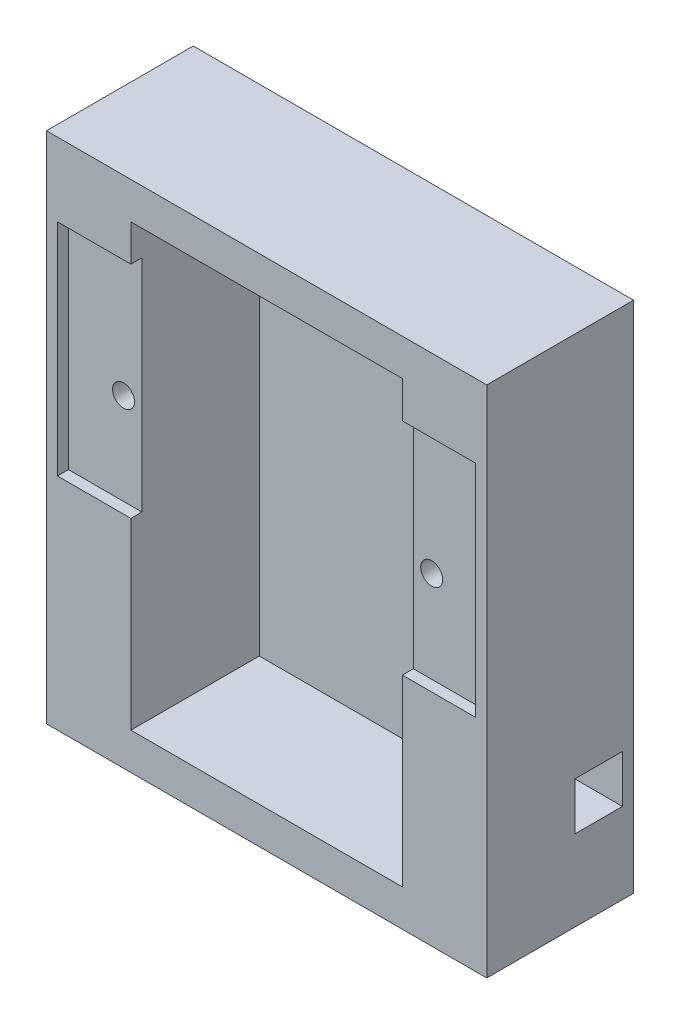
ISO-10303-21;
HEADER;
FILE_DESCRIPTION(('STEP AP214'),'2;1');
FILE_NAME('part.step','',(''),(''),'','','');
FILE_SCHEMA(('AUTOMOTIVE_DESIGN { 1 0 10303 214 1 1 1 1 }'));
ENDSEC;
DATA;
#1=APPLICATION_CONTEXT('core data for automotive mechanical design processes');
#2=APPLICATION_PROTOCOL_DEFINITION('international standard','automotive_design',2000,#1);
#3=PRODUCT_CONTEXT('',#1,'mechanical');
#4=PRODUCT('Part','Part','',(#3));
#5=PRODUCT_RELATED_PRODUCT_CATEGORY('part','',(#4));
#6=PRODUCT_DEFINITION_FORMATION('','',#4);
#7=PRODUCT_DEFINITION_CONTEXT('part definition',#1,'design');
#8=PRODUCT_DEFINITION('design','',#6,#7);
#9=PRODUCT_DEFINITION_SHAPE('','',#8);
#10=(LENGTH_UNIT() NAMED_UNIT(*) SI_UNIT(.MILLI.,.METRE.));
#11=(NAMED_UNIT(*) PLANE_ANGLE_UNIT() SI_UNIT($,.RADIAN.));
#12=(NAMED_UNIT(*) SI_UNIT($,.STERADIAN.) SOLID_ANGLE_UNIT());
#13=UNCERTAINTY_MEASURE_WITH_UNIT(LENGTH_MEASURE(1.E-05),#10,'distance_accuracy_value','');
#14=(GEOMETRIC_REPRESENTATION_CONTEXT(3) GLOBAL_UNCERTAINTY_ASSIGNED_CONTEXT((#13)) GLOBAL_UNIT_ASSIGNED_CONTEXT((#10,
#11,#12)) REPRESENTATION_CONTEXT('',''));
#15=CARTESIAN_POINT('',(0.,0.,0.));
#16=DIRECTION('',(0.,0.,1.));
#17=DIRECTION('',(1.,0.,0.));
#18=AXIS2_PLACEMENT_3D('',#15,#16,#17);
#19=CARTESIAN_POINT('',(-18.,-55.,0.));
#20=DIRECTION('',(0.,0.,1.));
#21=DIRECTION('',(1.,0.,0.));
#22=AXIS2_PLACEMENT_3D('',#19,#20,#21);
#23=CYLINDRICAL_SURFACE('',#22,3.);
#24=CARTESIAN_POINT('',(-18.,-55.,0.));
#25=DIRECTION('',(0.,0.,1.));
#26=DIRECTION('',(1.,0.,0.));
#27=AXIS2_PLACEMENT_3D('',#24,#25,#26);
#28=CIRCLE('',#27,3.);
#29=CARTESIAN_POINT('',(-15.,-55.,0.));
#30=VERTEX_POINT('',#29);
#31=EDGE_CURVE('E263',#30,#30,#28,.T.);
#32=ORIENTED_EDGE('',*,*,#31,.F.);
#33=EDGE_LOOP('',(#32));
#34=FACE_BOUND('',#33,.T.);
#35=CARTESIAN_POINT('',(-18.,-55.,37.));
#36=DIRECTION('',(0.,0.,1.));
#37=DIRECTION('',(1.,0.,0.));
#38=AXIS2_PLACEMENT_3D('',#35,#36,#37);
#39=CIRCLE('',#38,3.);
#40=CARTESIAN_POINT('',(-15.,-55.,37.));
#41=VERTEX_POINT('',#40);
#42=EDGE_CURVE('E39',#41,#41,#39,.F.);
#43=ORIENTED_EDGE('',*,*,#42,.F.);
#44=EDGE_LOOP('',(#43));
#45=FACE_BOUND('',#44,.T.);
#46=ADVANCED_FACE('F35',(#34,#45),#23,.F.);
#47=CARTESIAN_POINT('',(-102.,-55.,0.));
#48=DIRECTION('',(0.,0.,1.));
#49=DIRECTION('',(1.,0.,0.));
#50=AXIS2_PLACEMENT_3D('',#47,#48,#49);
#51=CYLINDRICAL_SURFACE('',#50,3.00000000000001);
#52=CARTESIAN_POINT('',(-102.,-55.,0.));
#53=DIRECTION('',(0.,0.,1.));
#54=DIRECTION('',(1.,0.,0.));
#55=AXIS2_PLACEMENT_3D('',#52,#53,#54);
#56=CIRCLE('',#55,3.00000000000001);
#57=CARTESIAN_POINT('',(-99.,-55.,0.));
#58=VERTEX_POINT('',#57);
#59=EDGE_CURVE('E270',#58,#58,#56,.T.);
#60=ORIENTED_EDGE('',*,*,#59,.F.);
#61=EDGE_LOOP('',(#60));
#62=FACE_BOUND('',#61,.T.);
#63=CARTESIAN_POINT('',(-102.,-55.,37.));
#64=DIRECTION('',(0.,0.,1.));
#65=DIRECTION('',(1.,0.,0.));
#66=AXIS2_PLACEMENT_3D('',#63,#64,#65);
#67=CIRCLE('',#66,3.00000000000001);
#68=CARTESIAN_POINT('',(-99.,-55.,37.));
#69=VERTEX_POINT('',#68);
#70=EDGE_CURVE('E209',#69,#69,#67,.F.);
#71=ORIENTED_EDGE('',*,*,#70,.F.);
#72=EDGE_LOOP('',(#71));
#73=FACE_BOUND('',#72,.T.);
#74=ADVANCED_FACE('F344',(#62,#73),#51,.F.);
#75=CARTESIAN_POINT('',(0.,0.,40.));
#76=DIRECTION('',(-1.,0.,0.));
#77=DIRECTION('',(0.,-1.,0.));
#78=AXIS2_PLACEMENT_3D('',#75,#76,#77);
#79=PLANE('',#78);
#80=DIRECTION('',(0.,0.,-1.));
#81=VECTOR('',#80,1.);
#82=CARTESIAN_POINT('',(0.,-118.,16.));
#83=LINE('',#82,#81);
#84=CARTESIAN_POINT('',(0.,-118.,16.));
#85=VERTEX_POINT('',#84);
#86=CARTESIAN_POINT('',(0.,-118.,3.));
#87=VERTEX_POINT('',#86);
#88=EDGE_CURVE('E253',#85,#87,#83,.T.);
#89=ORIENTED_EDGE('',*,*,#88,.F.);
#90=DIRECTION('',(0.,-1.,0.));
#91=VECTOR('',#90,1.);
#92=CARTESIAN_POINT('',(0.,-105.,16.));
#93=LINE('',#92,#91);
#94=CARTESIAN_POINT('',(0.,-105.,16.));
#95=VERTEX_POINT('',#94);
#96=EDGE_CURVE('E251',#95,#85,#93,.T.);
#97=ORIENTED_EDGE('',*,*,#96,.F.);
#98=DIRECTION('',(0.,0.,1.));
#99=VECTOR('',#98,1.);
#100=CARTESIAN_POINT('',(0.,-105.,16.));
#101=LINE('',#100,#99);
#102=CARTESIAN_POINT('',(0.,-105.,3.00000000000001));
#103=VERTEX_POINT('',#102);
#104=EDGE_CURVE('E241',#103,#95,#101,.T.);
#105=ORIENTED_EDGE('',*,*,#104,.F.);
#106=DIRECTION('',(0.,1.,0.));
#107=VECTOR('',#106,1.);
#108=CARTESIAN_POINT('',(0.,-105.,3.00000000000001));
#109=LINE('',#108,#107);
#110=EDGE_CURVE('E256',#87,#103,#109,.T.);
#111=ORIENTED_EDGE('',*,*,#110,.F.);
#112=EDGE_LOOP('',(#89,#97,#105,#111));
#113=FACE_BOUND('',#112,.T.);
#114=DIRECTION('',(0.,1.,0.));
#115=VECTOR('',#114,1.);
#116=CARTESIAN_POINT('',(0.,0.,0.));
#117=LINE('',#116,#115);
#118=CARTESIAN_POINT('',(0.,-140.,0.));
#119=VERTEX_POINT('',#118);
#120=CARTESIAN_POINT('',(0.,0.,0.));
#121=VERTEX_POINT('',#120);
#122=EDGE_CURVE('E304',#119,#121,#117,.T.);
#123=ORIENTED_EDGE('',*,*,#122,.T.);
#124=DIRECTION('',(0.,0.,-1.));
#125=VECTOR('',#124,1.);
#126=CARTESIAN_POINT('',(0.,0.,40.));
#127=LINE('',#126,#125);
#128=CARTESIAN_POINT('',(0.,0.,40.));
#129=VERTEX_POINT('',#128);
#130=EDGE_CURVE('E11',#129,#121,#127,.T.);
#131=ORIENTED_EDGE('',*,*,#130,.F.);
#132=DIRECTION('',(0.,1.,0.));
#133=VECTOR('',#132,1.);
#134=CARTESIAN_POINT('',(0.,0.,40.));
#135=LINE('',#134,#133);
#136=CARTESIAN_POINT('',(0.,-140.,40.));
#137=VERTEX_POINT('',#136);
#138=EDGE_CURVE('E312',#137,#129,#135,.T.);
#139=ORIENTED_EDGE('',*,*,#138,.F.);
#140=DIRECTION('',(0.,0.,-1.));
#141=VECTOR('',#140,1.);
#142=CARTESIAN_POINT('',(0.,-140.,40.));
#143=LINE('',#142,#141);
#144=EDGE_CURVE('E322',#137,#119,#143,.T.);
#145=ORIENTED_EDGE('',*,*,#144,.T.);
#146=EDGE_LOOP('',(#123,#131,#139,#145));
#147=FACE_BOUND('',#146,.T.);
#148=ADVANCED_FACE('F37',(#113,#147),#79,.F.);
#149=CARTESIAN_POINT('',(0.,0.,40.));
#150=DIRECTION('',(0.,-1.,0.));
#151=DIRECTION('',(1.,0.,0.));
#152=AXIS2_PLACEMENT_3D('',#149,#150,#151);
#153=PLANE('',#152);
#154=DIRECTION('',(-1.,0.,0.));
#155=VECTOR('',#154,1.);
#156=CARTESIAN_POINT('',(0.,0.,0.));
#157=LINE('',#156,#155);
#158=CARTESIAN_POINT('',(-120.,0.,0.));
#159=VERTEX_POINT('',#158);
#160=EDGE_CURVE('E325',#121,#159,#157,.T.);
#161=ORIENTED_EDGE('',*,*,#160,.T.);
#162=DIRECTION('',(0.,0.,-1.));
#163=VECTOR('',#162,1.);
#164=CARTESIAN_POINT('',(-120.,0.,40.));
#165=LINE('',#164,#163);
#166=CARTESIAN_POINT('',(-120.,0.,40.));
#167=VERTEX_POINT('',#166);
#168=EDGE_CURVE('E44',#167,#159,#165,.T.);
#169=ORIENTED_EDGE('',*,*,#168,.F.);
#170=DIRECTION('',(-1.,0.,0.));
#171=VECTOR('',#170,1.);
#172=CARTESIAN_POINT('',(0.,0.,40.));
#173=LINE('',#172,#171);
#174=EDGE_CURVE('E315',#129,#167,#173,.T.);
#175=ORIENTED_EDGE('',*,*,#174,.F.);
#176=ORIENTED_EDGE('',*,*,#130,.T.);
#177=EDGE_LOOP('',(#161,#169,#175,#176));
#178=FACE_BOUND('',#177,.T.);
#179=ADVANCED_FACE('F390',(#178),#153,.F.);
#180=CARTESIAN_POINT('',(-120.,0.,40.));
#181=DIRECTION('',(1.,0.,0.));
#182=DIRECTION('',(0.,1.,0.));
#183=AXIS2_PLACEMENT_3D('',#180,#181,#182);
#184=PLANE('',#183);
#185=DIRECTION('',(0.,-1.,0.));
#186=VECTOR('',#185,1.);
#187=CARTESIAN_POINT('',(-120.,0.,0.));
#188=LINE('',#187,#186);
#189=CARTESIAN_POINT('',(-120.,-140.,0.));
#190=VERTEX_POINT('',#189);
#191=EDGE_CURVE('E327',#159,#190,#188,.T.);
#192=ORIENTED_EDGE('',*,*,#191,.T.);
#193=DIRECTION('',(0.,0.,-1.));
#194=VECTOR('',#193,1.);
#195=CARTESIAN_POINT('',(-120.,-140.,40.));
#196=LINE('',#195,#194);
#197=CARTESIAN_POINT('',(-120.,-140.,40.));
#198=VERTEX_POINT('',#197);
#199=EDGE_CURVE('E332',#198,#190,#196,.T.);
#200=ORIENTED_EDGE('',*,*,#199,.F.);
#201=DIRECTION('',(0.,-1.,0.));
#202=VECTOR('',#201,1.);
#203=CARTESIAN_POINT('',(-120.,0.,40.));
#204=LINE('',#203,#202);
#205=EDGE_CURVE('E318',#167,#198,#204,.T.);
#206=ORIENTED_EDGE('',*,*,#205,.F.);
#207=ORIENTED_EDGE('',*,*,#168,.T.);
#208=EDGE_LOOP('',(#192,#200,#206,#207));
#209=FACE_BOUND('',#208,.T.);
#210=ADVANCED_FACE('F387',(#209),#184,.F.);
#211=CARTESIAN_POINT('',(0.,-140.,40.));
#212=DIRECTION('',(0.,1.,0.));
#213=DIRECTION('',(0.,0.,1.));
#214=AXIS2_PLACEMENT_3D('',#211,#212,#213);
#215=PLANE('',#214);
#216=DIRECTION('',(1.,0.,0.));
#217=VECTOR('',#216,1.);
#218=CARTESIAN_POINT('',(0.,-140.,0.));
#219=LINE('',#218,#217);
#220=EDGE_CURVE('E316',#190,#119,#219,.T.);
#221=ORIENTED_EDGE('',*,*,#220,.T.);
#222=ORIENTED_EDGE('',*,*,#144,.F.);
#223=DIRECTION('',(1.,0.,0.));
#224=VECTOR('',#223,1.);
#225=CARTESIAN_POINT('',(0.,-140.,40.));
#226=LINE('',#225,#224);
#227=EDGE_CURVE('E320',#198,#137,#226,.T.);
#228=ORIENTED_EDGE('',*,*,#227,.F.);
#229=ORIENTED_EDGE('',*,*,#199,.T.);
#230=EDGE_LOOP('',(#221,#222,#228,#229));
#231=FACE_BOUND('',#230,.T.);
#232=ADVANCED_FACE('F380',(#231),#215,.F.);
#233=CARTESIAN_POINT('',(0.,0.,40.));
#234=DIRECTION('',(0.,0.,-1.));
#235=DIRECTION('',(-1.,0.,0.));
#236=AXIS2_PLACEMENT_3D('',#233,#234,#235);
#237=PLANE('',#236);
#238=DIRECTION('',(0.,-1.,0.));
#239=VECTOR('',#238,1.);
#240=CARTESIAN_POINT('',(-117.,-20.,40.));
#241=LINE('',#240,#239);
#242=CARTESIAN_POINT('',(-117.,-20.,40.));
#243=VERTEX_POINT('',#242);
#244=CARTESIAN_POINT('',(-117.,-80.,40.));
#245=VERTEX_POINT('',#244);
#246=EDGE_CURVE('E182',#243,#245,#241,.T.);
#247=ORIENTED_EDGE('',*,*,#246,.F.);
#248=DIRECTION('',(-1.,0.,0.));
#249=VECTOR('',#248,1.);
#250=CARTESIAN_POINT('',(-117.,-20.,40.));
#251=LINE('',#250,#249);
#252=CARTESIAN_POINT('',(-97.,-20.,40.));
#253=VERTEX_POINT('',#252);
#254=EDGE_CURVE('E196',#253,#243,#251,.T.);
#255=ORIENTED_EDGE('',*,*,#254,.F.);
#256=DIRECTION('',(0.,-1.,0.));
#257=VECTOR('',#256,1.);
#258=CARTESIAN_POINT('',(-97.,-10.,40.));
#259=LINE('',#258,#257);
#260=CARTESIAN_POINT('',(-97.,-10.,40.));
#261=VERTEX_POINT('',#260);
#262=EDGE_CURVE('E290',#261,#253,#259,.T.);
#263=ORIENTED_EDGE('',*,*,#262,.F.);
#264=DIRECTION('',(-1.,0.,0.));
#265=VECTOR('',#264,1.);
#266=CARTESIAN_POINT('',(-97.,-10.,40.));
#267=LINE('',#266,#265);
#268=CARTESIAN_POINT('',(-23.,-10.,40.));
#269=VERTEX_POINT('',#268);
#270=EDGE_CURVE('E280',#269,#261,#267,.T.);
#271=ORIENTED_EDGE('',*,*,#270,.F.);
#272=DIRECTION('',(0.,1.,0.));
#273=VECTOR('',#272,1.);
#274=CARTESIAN_POINT('',(-23.,-10.,40.));
#275=LINE('',#274,#273);
#276=CARTESIAN_POINT('',(-23.,-20.,40.));
#277=VERTEX_POINT('',#276);
#278=EDGE_CURVE('E296',#277,#269,#275,.T.);
#279=ORIENTED_EDGE('',*,*,#278,.F.);
#280=DIRECTION('',(-1.,0.,0.));
#281=VECTOR('',#280,1.);
#282=CARTESIAN_POINT('',(-23.,-20.,40.));
#283=LINE('',#282,#281);
#284=CARTESIAN_POINT('',(-2.99999999999998,-20.,40.));
#285=VERTEX_POINT('',#284);
#286=EDGE_CURVE('E216',#285,#277,#283,.T.);
#287=ORIENTED_EDGE('',*,*,#286,.F.);
#288=DIRECTION('',(0.,1.,0.));
#289=VECTOR('',#288,1.);
#290=CARTESIAN_POINT('',(-2.99999999999998,-20.,40.));
#291=LINE('',#290,#289);
#292=CARTESIAN_POINT('',(-2.99999999999997,-80.,40.));
#293=VERTEX_POINT('',#292);
#294=EDGE_CURVE('E226',#293,#285,#291,.T.);
#295=ORIENTED_EDGE('',*,*,#294,.F.);
#296=DIRECTION('',(1.,0.,0.));
#297=VECTOR('',#296,1.);
#298=CARTESIAN_POINT('',(-23.,-80.,40.));
#299=LINE('',#298,#297);
#300=CARTESIAN_POINT('',(-23.,-80.,40.));
#301=VERTEX_POINT('',#300);
#302=EDGE_CURVE('E223',#301,#293,#299,.T.);
#303=ORIENTED_EDGE('',*,*,#302,.F.);
#304=CARTESIAN_POINT('',(-23.,-130.,40.));
#305=VERTEX_POINT('',#304);
#306=EDGE_CURVE('E297',#305,#301,#275,.T.);
#307=ORIENTED_EDGE('',*,*,#306,.F.);
#308=DIRECTION('',(1.,0.,0.));
#309=VECTOR('',#308,1.);
#310=CARTESIAN_POINT('',(-97.,-130.,40.));
#311=LINE('',#310,#309);
#312=CARTESIAN_POINT('',(-97.,-130.,40.));
#313=VERTEX_POINT('',#312);
#314=EDGE_CURVE('E293',#313,#305,#311,.T.);
#315=ORIENTED_EDGE('',*,*,#314,.F.);
#316=CARTESIAN_POINT('',(-97.,-80.,40.));
#317=VERTEX_POINT('',#316);
#318=EDGE_CURVE('E273',#317,#313,#259,.T.);
#319=ORIENTED_EDGE('',*,*,#318,.F.);
#320=DIRECTION('',(1.,0.,0.));
#321=VECTOR('',#320,1.);
#322=CARTESIAN_POINT('',(-117.,-80.,40.));
#323=LINE('',#322,#321);
#324=EDGE_CURVE('E199',#245,#317,#323,.T.);
#325=ORIENTED_EDGE('',*,*,#324,.F.);
#326=EDGE_LOOP('',(#247,#255,#263,#271,#279,#287,#295,#303,#307,#315,#319,#325));
#327=FACE_BOUND('',#326,.T.);
#328=ORIENTED_EDGE('',*,*,#138,.T.);
#329=ORIENTED_EDGE('',*,*,#174,.T.);
#330=ORIENTED_EDGE('',*,*,#205,.T.);
#331=ORIENTED_EDGE('',*,*,#227,.T.);
#332=EDGE_LOOP('',(#328,#329,#330,#331));
#333=FACE_BOUND('',#332,.T.);
#334=ADVANCED_FACE('F377',(#327,#333),#237,.F.);
#335=CARTESIAN_POINT('',(0.,0.,0.));
#336=DIRECTION('',(0.,0.,-1.));
#337=DIRECTION('',(-1.,0.,0.));
#338=AXIS2_PLACEMENT_3D('',#335,#336,#337);
#339=PLANE('',#338);
#340=ORIENTED_EDGE('',*,*,#59,.T.);
#341=EDGE_LOOP('',(#340));
#342=FACE_BOUND('',#341,.T.);
#343=ORIENTED_EDGE('',*,*,#31,.T.);
#344=EDGE_LOOP('',(#343));
#345=FACE_BOUND('',#344,.T.);
#346=ORIENTED_EDGE('',*,*,#122,.F.);
#347=ORIENTED_EDGE('',*,*,#220,.F.);
#348=ORIENTED_EDGE('',*,*,#191,.F.);
#349=ORIENTED_EDGE('',*,*,#160,.F.);
#350=EDGE_LOOP('',(#346,#347,#348,#349));
#351=FACE_BOUND('',#350,.T.);
#352=ADVANCED_FACE('F375',(#342,#345,#351),#339,.T.);
#353=CARTESIAN_POINT('',(-97.,-10.,5.));
#354=DIRECTION('',(-1.,0.,0.));
#355=DIRECTION('',(0.,-1.,0.));
#356=AXIS2_PLACEMENT_3D('',#353,#354,#355);
#357=PLANE('',#356);
#358=ORIENTED_EDGE('',*,*,#262,.T.);
#359=DIRECTION('',(0.,0.,1.));
#360=VECTOR('',#359,1.);
#361=CARTESIAN_POINT('',(-97.,-20.,37.));
#362=LINE('',#361,#360);
#363=CARTESIAN_POINT('',(-97.,-20.,37.));
#364=VERTEX_POINT('',#363);
#365=EDGE_CURVE('E210',#364,#253,#362,.T.);
#366=ORIENTED_EDGE('',*,*,#365,.F.);
#367=DIRECTION('',(0.,1.,0.));
#368=VECTOR('',#367,1.);
#369=CARTESIAN_POINT('',(-97.,-20.,37.));
#370=LINE('',#369,#368);
#371=CARTESIAN_POINT('',(-97.,-80.,37.));
#372=VERTEX_POINT('',#371);
#373=EDGE_CURVE('E191',#372,#364,#370,.T.);
#374=ORIENTED_EDGE('',*,*,#373,.F.);
#375=DIRECTION('',(0.,0.,1.));
#376=VECTOR('',#375,1.);
#377=CARTESIAN_POINT('',(-97.,-80.,37.));
#378=LINE('',#377,#376);
#379=EDGE_CURVE('E185',#372,#317,#378,.T.);
#380=ORIENTED_EDGE('',*,*,#379,.T.);
#381=ORIENTED_EDGE('',*,*,#318,.T.);
#382=DIRECTION('',(0.,0.,1.));
#383=VECTOR('',#382,1.);
#384=CARTESIAN_POINT('',(-97.,-130.,5.));
#385=LINE('',#384,#383);
#386=CARTESIAN_POINT('',(-97.,-130.,5.));
#387=VERTEX_POINT('',#386);
#388=EDGE_CURVE('E289',#387,#313,#385,.T.);
#389=ORIENTED_EDGE('',*,*,#388,.F.);
#390=DIRECTION('',(0.,-1.,0.));
#391=VECTOR('',#390,1.);
#392=CARTESIAN_POINT('',(-97.,-10.,5.));
#393=LINE('',#392,#391);
#394=CARTESIAN_POINT('',(-97.,-10.,5.));
#395=VERTEX_POINT('',#394);
#396=EDGE_CURVE('E276',#395,#387,#393,.T.);
#397=ORIENTED_EDGE('',*,*,#396,.F.);
#398=DIRECTION('',(0.,0.,1.));
#399=VECTOR('',#398,1.);
#400=CARTESIAN_POINT('',(-97.,-10.,5.));
#401=LINE('',#400,#399);
#402=EDGE_CURVE('E302',#395,#261,#401,.T.);
#403=ORIENTED_EDGE('',*,*,#402,.T.);
#404=EDGE_LOOP('',(#358,#366,#374,#380,#381,#389,#397,#403));
#405=FACE_BOUND('',#404,.T.);
#406=ADVANCED_FACE('F365',(#405),#357,.F.);
#407=CARTESIAN_POINT('',(-97.,-10.,5.));
#408=DIRECTION('',(0.,1.,0.));
#409=DIRECTION('',(0.,0.,1.));
#410=AXIS2_PLACEMENT_3D('',#407,#408,#409);
#411=PLANE('',#410);
#412=ORIENTED_EDGE('',*,*,#270,.T.);
#413=ORIENTED_EDGE('',*,*,#402,.F.);
#414=DIRECTION('',(-1.,0.,0.));
#415=VECTOR('',#414,1.);
#416=CARTESIAN_POINT('',(-97.,-10.,5.));
#417=LINE('',#416,#415);
#418=CARTESIAN_POINT('',(-23.,-10.,5.));
#419=VERTEX_POINT('',#418);
#420=EDGE_CURVE('E286',#419,#395,#417,.T.);
#421=ORIENTED_EDGE('',*,*,#420,.F.);
#422=DIRECTION('',(0.,0.,1.));
#423=VECTOR('',#422,1.);
#424=CARTESIAN_POINT('',(-23.,-10.,5.));
#425=LINE('',#424,#423);
#426=EDGE_CURVE('E305',#419,#269,#425,.T.);
#427=ORIENTED_EDGE('',*,*,#426,.T.);
#428=EDGE_LOOP('',(#412,#413,#421,#427));
#429=FACE_BOUND('',#428,.T.);
#430=ADVANCED_FACE('F361',(#429),#411,.F.);
#431=CARTESIAN_POINT('',(-23.,-10.,5.));
#432=DIRECTION('',(1.,0.,0.));
#433=DIRECTION('',(0.,1.,0.));
#434=AXIS2_PLACEMENT_3D('',#431,#432,#433);
#435=PLANE('',#434);
#436=DIRECTION('',(0.,-1.,0.));
#437=VECTOR('',#436,1.);
#438=CARTESIAN_POINT('',(-23.,-20.,37.));
#439=LINE('',#438,#437);
#440=CARTESIAN_POINT('',(-23.,-20.,37.));
#441=VERTEX_POINT('',#440);
#442=CARTESIAN_POINT('',(-23.,-80.,37.));
#443=VERTEX_POINT('',#442);
#444=EDGE_CURVE('E213',#441,#443,#439,.T.);
#445=ORIENTED_EDGE('',*,*,#444,.F.);
#446=DIRECTION('',(0.,0.,1.));
#447=VECTOR('',#446,1.);
#448=CARTESIAN_POINT('',(-23.,-20.,37.));
#449=LINE('',#448,#447);
#450=EDGE_CURVE('E205',#441,#277,#449,.T.);
#451=ORIENTED_EDGE('',*,*,#450,.T.);
#452=ORIENTED_EDGE('',*,*,#278,.T.);
#453=ORIENTED_EDGE('',*,*,#426,.F.);
#454=DIRECTION('',(0.,1.,0.));
#455=VECTOR('',#454,1.);
#456=CARTESIAN_POINT('',(-23.,-10.,5.));
#457=LINE('',#456,#455);
#458=CARTESIAN_POINT('',(-23.,-130.,5.));
#459=VERTEX_POINT('',#458);
#460=EDGE_CURVE('E283',#459,#419,#457,.T.);
#461=ORIENTED_EDGE('',*,*,#460,.F.);
#462=DIRECTION('',(0.,0.,1.));
#463=VECTOR('',#462,1.);
#464=CARTESIAN_POINT('',(-23.,-130.,5.));
#465=LINE('',#464,#463);
#466=EDGE_CURVE('E308',#459,#305,#465,.T.);
#467=ORIENTED_EDGE('',*,*,#466,.T.);
#468=ORIENTED_EDGE('',*,*,#306,.T.);
#469=DIRECTION('',(0.,0.,1.));
#470=VECTOR('',#469,1.);
#471=CARTESIAN_POINT('',(-23.,-80.,37.));
#472=LINE('',#471,#470);
#473=EDGE_CURVE('E222',#443,#301,#472,.T.);
#474=ORIENTED_EDGE('',*,*,#473,.F.);
#475=EDGE_LOOP('',(#445,#451,#452,#453,#461,#467,#468,#474));
#476=FACE_BOUND('',#475,.T.);
#477=ADVANCED_FACE('F364',(#476),#435,.F.);
#478=CARTESIAN_POINT('',(-97.,-130.,5.));
#479=DIRECTION('',(0.,-1.,0.));
#480=DIRECTION('',(0.,0.,-1.));
#481=AXIS2_PLACEMENT_3D('',#478,#479,#480);
#482=PLANE('',#481);
#483=ORIENTED_EDGE('',*,*,#314,.T.);
#484=ORIENTED_EDGE('',*,*,#466,.F.);
#485=DIRECTION('',(1.,0.,0.));
#486=VECTOR('',#485,1.);
#487=CARTESIAN_POINT('',(-97.,-130.,5.));
#488=LINE('',#487,#486);
#489=EDGE_CURVE('E279',#387,#459,#488,.T.);
#490=ORIENTED_EDGE('',*,*,#489,.F.);
#491=ORIENTED_EDGE('',*,*,#388,.T.);
#492=EDGE_LOOP('',(#483,#484,#490,#491));
#493=FACE_BOUND('',#492,.T.);
#494=ADVANCED_FACE('F359',(#493),#482,.F.);
#495=CARTESIAN_POINT('',(0.,0.,5.));
#496=DIRECTION('',(0.,0.,1.));
#497=DIRECTION('',(1.,0.,0.));
#498=AXIS2_PLACEMENT_3D('',#495,#496,#497);
#499=PLANE('',#498);
#500=ORIENTED_EDGE('',*,*,#396,.T.);
#501=ORIENTED_EDGE('',*,*,#489,.T.);
#502=ORIENTED_EDGE('',*,*,#460,.T.);
#503=ORIENTED_EDGE('',*,*,#420,.T.);
#504=EDGE_LOOP('',(#500,#501,#502,#503));
#505=FACE_BOUND('',#504,.T.);
#506=ADVANCED_FACE('F355',(#505),#499,.T.);
#507=CARTESIAN_POINT('',(-22.,-105.,16.));
#508=DIRECTION('',(0.,0.,1.));
#509=DIRECTION('',(0.,-1.,0.));
#510=AXIS2_PLACEMENT_3D('',#507,#508,#509);
#511=PLANE('',#510);
#512=ORIENTED_EDGE('',*,*,#96,.T.);
#513=DIRECTION('',(1.,0.,0.));
#514=VECTOR('',#513,1.);
#515=CARTESIAN_POINT('',(-22.,-118.,16.));
#516=LINE('',#515,#514);
#517=CARTESIAN_POINT('',(-22.,-118.,16.));
#518=VERTEX_POINT('',#517);
#519=EDGE_CURVE('E250',#518,#85,#516,.T.);
#520=ORIENTED_EDGE('',*,*,#519,.F.);
#521=DIRECTION('',(0.,-1.,0.));
#522=VECTOR('',#521,1.);
#523=CARTESIAN_POINT('',(-22.,-105.,16.));
#524=LINE('',#523,#522);
#525=CARTESIAN_POINT('',(-22.,-105.,16.));
#526=VERTEX_POINT('',#525);
#527=EDGE_CURVE('E237',#526,#518,#524,.T.);
#528=ORIENTED_EDGE('',*,*,#527,.F.);
#529=DIRECTION('',(1.,0.,0.));
#530=VECTOR('',#529,1.);
#531=CARTESIAN_POINT('',(-22.,-105.,16.));
#532=LINE('',#531,#530);
#533=EDGE_CURVE('E261',#526,#95,#532,.T.);
#534=ORIENTED_EDGE('',*,*,#533,.T.);
#535=EDGE_LOOP('',(#512,#520,#528,#534));
#536=FACE_BOUND('',#535,.T.);
#537=ADVANCED_FACE('F358',(#536),#511,.F.);
#538=CARTESIAN_POINT('',(-22.,-105.,16.));
#539=DIRECTION('',(0.,1.,0.));
#540=DIRECTION('',(-1.,0.,0.));
#541=AXIS2_PLACEMENT_3D('',#538,#539,#540);
#542=PLANE('',#541);
#543=ORIENTED_EDGE('',*,*,#104,.T.);
#544=ORIENTED_EDGE('',*,*,#533,.F.);
#545=DIRECTION('',(0.,0.,1.));
#546=VECTOR('',#545,1.);
#547=CARTESIAN_POINT('',(-22.,-105.,16.));
#548=LINE('',#547,#546);
#549=CARTESIAN_POINT('',(-22.,-105.,3.00000000000001));
#550=VERTEX_POINT('',#549);
#551=EDGE_CURVE('E247',#550,#526,#548,.T.);
#552=ORIENTED_EDGE('',*,*,#551,.F.);
#553=DIRECTION('',(1.,0.,0.));
#554=VECTOR('',#553,1.);
#555=CARTESIAN_POINT('',(-22.,-105.,3.00000000000001));
#556=LINE('',#555,#554);
#557=EDGE_CURVE('E264',#550,#103,#556,.T.);
#558=ORIENTED_EDGE('',*,*,#557,.T.);
#559=EDGE_LOOP('',(#543,#544,#552,#558));
#560=FACE_BOUND('',#559,.T.);
#561=ADVANCED_FACE('F425',(#560),#542,.F.);
#562=CARTESIAN_POINT('',(-22.,-105.,3.00000000000001));
#563=DIRECTION('',(0.,0.,-1.));
#564=DIRECTION('',(0.,1.,0.));
#565=AXIS2_PLACEMENT_3D('',#562,#563,#564);
#566=PLANE('',#565);
#567=ORIENTED_EDGE('',*,*,#110,.T.);
#568=ORIENTED_EDGE('',*,*,#557,.F.);
#569=DIRECTION('',(0.,1.,0.));
#570=VECTOR('',#569,1.);
#571=CARTESIAN_POINT('',(-22.,-105.,3.00000000000001));
#572=LINE('',#571,#570);
#573=CARTESIAN_POINT('',(-22.,-118.,3.));
#574=VERTEX_POINT('',#573);
#575=EDGE_CURVE('E244',#574,#550,#572,.T.);
#576=ORIENTED_EDGE('',*,*,#575,.F.);
#577=DIRECTION('',(1.,0.,0.));
#578=VECTOR('',#577,1.);
#579=CARTESIAN_POINT('',(-22.,-118.,3.));
#580=LINE('',#579,#578);
#581=EDGE_CURVE('E266',#574,#87,#580,.T.);
#582=ORIENTED_EDGE('',*,*,#581,.T.);
#583=EDGE_LOOP('',(#567,#568,#576,#582));
#584=FACE_BOUND('',#583,.T.);
#585=ADVANCED_FACE('F427',(#584),#566,.F.);
#586=CARTESIAN_POINT('',(-22.,-118.,16.));
#587=DIRECTION('',(0.,-1.,0.));
#588=DIRECTION('',(1.,0.,0.));
#589=AXIS2_PLACEMENT_3D('',#586,#587,#588);
#590=PLANE('',#589);
#591=ORIENTED_EDGE('',*,*,#88,.T.);
#592=ORIENTED_EDGE('',*,*,#581,.F.);
#593=DIRECTION('',(0.,0.,-1.));
#594=VECTOR('',#593,1.);
#595=CARTESIAN_POINT('',(-22.,-118.,16.));
#596=LINE('',#595,#594);
#597=EDGE_CURVE('E240',#518,#574,#596,.T.);
#598=ORIENTED_EDGE('',*,*,#597,.F.);
#599=ORIENTED_EDGE('',*,*,#519,.T.);
#600=EDGE_LOOP('',(#591,#592,#598,#599));
#601=FACE_BOUND('',#600,.T.);
#602=ADVANCED_FACE('F418',(#601),#590,.F.);
#603=CARTESIAN_POINT('',(-22.,0.,0.));
#604=DIRECTION('',(1.,0.,0.));
#605=DIRECTION('',(0.,1.,0.));
#606=AXIS2_PLACEMENT_3D('',#603,#604,#605);
#607=PLANE('',#606);
#608=ORIENTED_EDGE('',*,*,#527,.T.);
#609=ORIENTED_EDGE('',*,*,#597,.T.);
#610=ORIENTED_EDGE('',*,*,#575,.T.);
#611=ORIENTED_EDGE('',*,*,#551,.T.);
#612=EDGE_LOOP('',(#608,#609,#610,#611));
#613=FACE_BOUND('',#612,.T.);
#614=ADVANCED_FACE('F429',(#613),#607,.T.);
#615=CARTESIAN_POINT('',(0.,0.,37.));
#616=DIRECTION('',(0.,0.,1.));
#617=DIRECTION('',(1.,0.,0.));
#618=AXIS2_PLACEMENT_3D('',#615,#616,#617);
#619=PLANE('',#618);
#620=DIRECTION('',(0.,-1.,0.));
#621=VECTOR('',#620,1.);
#622=CARTESIAN_POINT('',(-117.,-20.,37.));
#623=LINE('',#622,#621);
#624=CARTESIAN_POINT('',(-117.,-20.,37.));
#625=VERTEX_POINT('',#624);
#626=CARTESIAN_POINT('',(-117.,-80.,37.));
#627=VERTEX_POINT('',#626);
#628=EDGE_CURVE('E179',#625,#627,#623,.T.);
#629=ORIENTED_EDGE('',*,*,#628,.T.);
#630=DIRECTION('',(1.,0.,0.));
#631=VECTOR('',#630,1.);
#632=CARTESIAN_POINT('',(-117.,-80.,37.));
#633=LINE('',#632,#631);
#634=EDGE_CURVE('E52',#627,#372,#633,.T.);
#635=ORIENTED_EDGE('',*,*,#634,.T.);
#636=ORIENTED_EDGE('',*,*,#373,.T.);
#637=DIRECTION('',(-1.,0.,0.));
#638=VECTOR('',#637,1.);
#639=CARTESIAN_POINT('',(-117.,-20.,37.));
#640=LINE('',#639,#638);
#641=EDGE_CURVE('E186',#364,#625,#640,.T.);
#642=ORIENTED_EDGE('',*,*,#641,.T.);
#643=EDGE_LOOP('',(#629,#635,#636,#642));
#644=FACE_BOUND('',#643,.T.);
#645=ORIENTED_EDGE('',*,*,#70,.T.);
#646=EDGE_LOOP('',(#645));
#647=FACE_BOUND('',#646,.T.);
#648=ADVANCED_FACE('F193',(#644,#647),#619,.T.);
#649=CARTESIAN_POINT('',(-117.,-20.,37.));
#650=DIRECTION('',(-1.,0.,0.));
#651=DIRECTION('',(0.,-1.,0.));
#652=AXIS2_PLACEMENT_3D('',#649,#650,#651);
#653=PLANE('',#652);
#654=ORIENTED_EDGE('',*,*,#246,.T.);
#655=DIRECTION('',(0.,0.,1.));
#656=VECTOR('',#655,1.);
#657=CARTESIAN_POINT('',(-117.,-80.,37.));
#658=LINE('',#657,#656);
#659=EDGE_CURVE('E177',#627,#245,#658,.T.);
#660=ORIENTED_EDGE('',*,*,#659,.F.);
#661=ORIENTED_EDGE('',*,*,#628,.F.);
#662=DIRECTION('',(0.,0.,1.));
#663=VECTOR('',#662,1.);
#664=CARTESIAN_POINT('',(-117.,-20.,37.));
#665=LINE('',#664,#663);
#666=EDGE_CURVE('E207',#625,#243,#665,.T.);
#667=ORIENTED_EDGE('',*,*,#666,.T.);
#668=EDGE_LOOP('',(#654,#660,#661,#667));
#669=FACE_BOUND('',#668,.T.);
#670=ADVANCED_FACE('F178',(#669),#653,.F.);
#671=CARTESIAN_POINT('',(-117.,-20.,37.));
#672=DIRECTION('',(0.,1.,0.));
#673=DIRECTION('',(-1.,0.,0.));
#674=AXIS2_PLACEMENT_3D('',#671,#672,#673);
#675=PLANE('',#674);
#676=ORIENTED_EDGE('',*,*,#254,.T.);
#677=ORIENTED_EDGE('',*,*,#666,.F.);
#678=ORIENTED_EDGE('',*,*,#641,.F.);
#679=ORIENTED_EDGE('',*,*,#365,.T.);
#680=EDGE_LOOP('',(#676,#677,#678,#679));
#681=FACE_BOUND('',#680,.T.);
#682=ADVANCED_FACE('F513',(#681),#675,.F.);
#683=CARTESIAN_POINT('',(-117.,-80.,37.));
#684=DIRECTION('',(0.,-1.,0.));
#685=DIRECTION('',(0.,0.,-1.));
#686=AXIS2_PLACEMENT_3D('',#683,#684,#685);
#687=PLANE('',#686);
#688=ORIENTED_EDGE('',*,*,#324,.T.);
#689=ORIENTED_EDGE('',*,*,#379,.F.);
#690=ORIENTED_EDGE('',*,*,#634,.F.);
#691=ORIENTED_EDGE('',*,*,#659,.T.);
#692=EDGE_LOOP('',(#688,#689,#690,#691));
#693=FACE_BOUND('',#692,.T.);
#694=ADVANCED_FACE('F188',(#693),#687,.F.);
#695=CARTESIAN_POINT('',(0.,0.,37.));
#696=DIRECTION('',(0.,0.,1.));
#697=DIRECTION('',(1.,0.,0.));
#698=AXIS2_PLACEMENT_3D('',#695,#696,#697);
#699=PLANE('',#698);
#700=ORIENTED_EDGE('',*,*,#444,.T.);
#701=DIRECTION('',(1.,0.,0.));
#702=VECTOR('',#701,1.);
#703=CARTESIAN_POINT('',(-23.,-80.,37.));
#704=LINE('',#703,#702);
#705=CARTESIAN_POINT('',(-2.99999999999997,-80.,37.));
#706=VERTEX_POINT('',#705);
#707=EDGE_CURVE('E215',#443,#706,#704,.T.);
#708=ORIENTED_EDGE('',*,*,#707,.T.);
#709=DIRECTION('',(0.,1.,0.));
#710=VECTOR('',#709,1.);
#711=CARTESIAN_POINT('',(-2.99999999999998,-20.,37.));
#712=LINE('',#711,#710);
#713=CARTESIAN_POINT('',(-2.99999999999998,-20.,37.));
#714=VERTEX_POINT('',#713);
#715=EDGE_CURVE('E219',#706,#714,#712,.T.);
#716=ORIENTED_EDGE('',*,*,#715,.T.);
#717=DIRECTION('',(-1.,0.,0.));
#718=VECTOR('',#717,1.);
#719=CARTESIAN_POINT('',(-23.,-20.,37.));
#720=LINE('',#719,#718);
#721=EDGE_CURVE('E60',#714,#441,#720,.T.);
#722=ORIENTED_EDGE('',*,*,#721,.T.);
#723=EDGE_LOOP('',(#700,#708,#716,#722));
#724=FACE_BOUND('',#723,.T.);
#725=ORIENTED_EDGE('',*,*,#42,.T.);
#726=EDGE_LOOP('',(#725));
#727=FACE_BOUND('',#726,.T.);
#728=ADVANCED_FACE('F341',(#724,#727),#699,.T.);
#729=CARTESIAN_POINT('',(-23.,-20.,37.));
#730=DIRECTION('',(0.,1.,0.));
#731=DIRECTION('',(-1.,0.,0.));
#732=AXIS2_PLACEMENT_3D('',#729,#730,#731);
#733=PLANE('',#732);
#734=ORIENTED_EDGE('',*,*,#286,.T.);
#735=ORIENTED_EDGE('',*,*,#450,.F.);
#736=ORIENTED_EDGE('',*,*,#721,.F.);
#737=DIRECTION('',(0.,0.,1.));
#738=VECTOR('',#737,1.);
#739=CARTESIAN_POINT('',(-2.99999999999998,-20.,37.));
#740=LINE('',#739,#738);
#741=EDGE_CURVE('E232',#714,#285,#740,.T.);
#742=ORIENTED_EDGE('',*,*,#741,.T.);
#743=EDGE_LOOP('',(#734,#735,#736,#742));
#744=FACE_BOUND('',#743,.T.);
#745=ADVANCED_FACE('F539',(#744),#733,.F.);
#746=CARTESIAN_POINT('',(-2.99999999999998,-20.,37.));
#747=DIRECTION('',(1.,0.,0.));
#748=DIRECTION('',(0.,1.,0.));
#749=AXIS2_PLACEMENT_3D('',#746,#747,#748);
#750=PLANE('',#749);
#751=ORIENTED_EDGE('',*,*,#294,.T.);
#752=ORIENTED_EDGE('',*,*,#741,.F.);
#753=ORIENTED_EDGE('',*,*,#715,.F.);
#754=DIRECTION('',(0.,0.,1.));
#755=VECTOR('',#754,1.);
#756=CARTESIAN_POINT('',(-2.99999999999997,-80.,37.));
#757=LINE('',#756,#755);
#758=EDGE_CURVE('E234',#706,#293,#757,.T.);
#759=ORIENTED_EDGE('',*,*,#758,.T.);
#760=EDGE_LOOP('',(#751,#752,#753,#759));
#761=FACE_BOUND('',#760,.T.);
#762=ADVANCED_FACE('F548',(#761),#750,.F.);
#763=CARTESIAN_POINT('',(-23.,-80.,37.));
#764=DIRECTION('',(0.,-1.,0.));
#765=DIRECTION('',(0.,0.,-1.));
#766=AXIS2_PLACEMENT_3D('',#763,#764,#765);
#767=PLANE('',#766);
#768=ORIENTED_EDGE('',*,*,#302,.T.);
#769=ORIENTED_EDGE('',*,*,#758,.F.);
#770=ORIENTED_EDGE('',*,*,#707,.F.);
#771=ORIENTED_EDGE('',*,*,#473,.T.);
#772=EDGE_LOOP('',(#768,#769,#770,#771));
#773=FACE_BOUND('',#772,.T.);
#774=ADVANCED_FACE('F440',(#773),#767,.F.);
#775=CLOSED_SHELL('',(#46,#74,#148,#179,#210,#232,#334,#352,#406,#430,#477,#494,#506,#537,#561,
#585,#602,#614,#648,#670,#682,#694,#728,#745,#762,#774));
#776=MANIFOLD_SOLID_BREP('B2',#775);
#777=ADVANCED_BREP_SHAPE_REPRESENTATION('',(#18,#776),#14);
#778=SHAPE_DEFINITION_REPRESENTATION(#9,#777);
ENDSEC;
END-ISO-10303-21;
